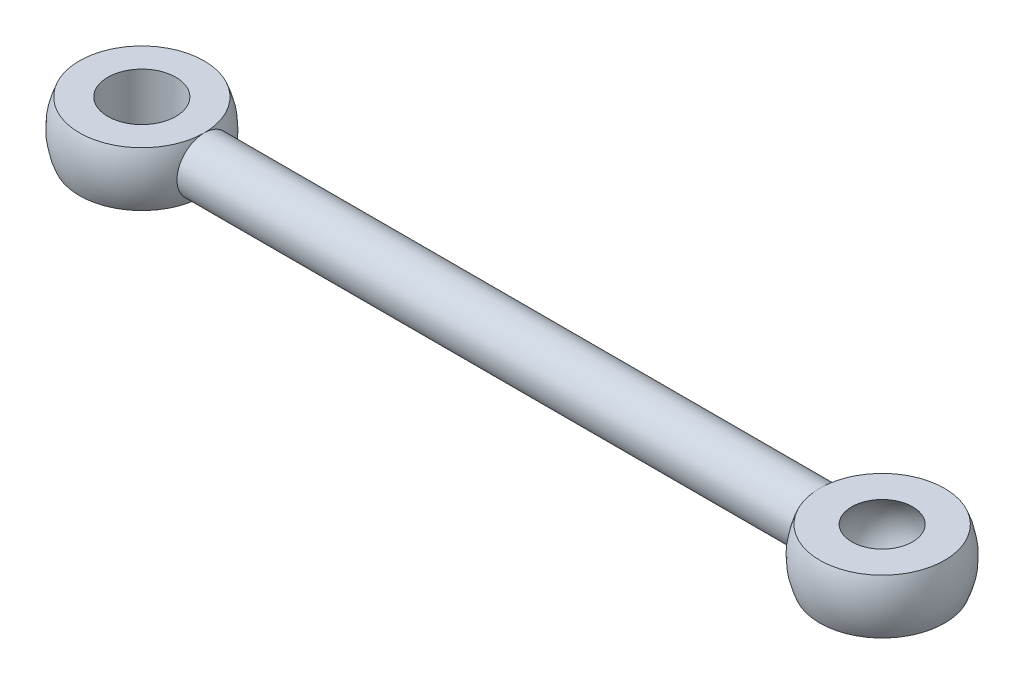
ISO-10303-21;
HEADER;
FILE_DESCRIPTION(('STEP AP214'),'2;1');
FILE_NAME('part.step','',(''),(''),'','','');
FILE_SCHEMA(('AUTOMOTIVE_DESIGN { 1 0 10303 214 1 1 1 1 }'));
ENDSEC;
DATA;
#1=APPLICATION_CONTEXT('core data for automotive mechanical design processes');
#2=APPLICATION_PROTOCOL_DEFINITION('international standard','automotive_design',2000,#1);
#3=PRODUCT_CONTEXT('',#1,'mechanical');
#4=PRODUCT('Part','Part','',(#3));
#5=PRODUCT_RELATED_PRODUCT_CATEGORY('part','',(#4));
#6=PRODUCT_DEFINITION_FORMATION('','',#4);
#7=PRODUCT_DEFINITION_CONTEXT('part definition',#1,'design');
#8=PRODUCT_DEFINITION('design','',#6,#7);
#9=PRODUCT_DEFINITION_SHAPE('','',#8);
#10=(LENGTH_UNIT() NAMED_UNIT(*) SI_UNIT(.MILLI.,.METRE.));
#11=(NAMED_UNIT(*) PLANE_ANGLE_UNIT() SI_UNIT($,.RADIAN.));
#12=(NAMED_UNIT(*) SI_UNIT($,.STERADIAN.) SOLID_ANGLE_UNIT());
#13=UNCERTAINTY_MEASURE_WITH_UNIT(LENGTH_MEASURE(1.E-05),#10,'distance_accuracy_value','');
#14=(GEOMETRIC_REPRESENTATION_CONTEXT(3) GLOBAL_UNCERTAINTY_ASSIGNED_CONTEXT((#13)) GLOBAL_UNIT_ASSIGNED_CONTEXT((#10,
#11,#12)) REPRESENTATION_CONTEXT('',''));
#15=CARTESIAN_POINT('',(0.,0.,0.));
#16=DIRECTION('',(0.,0.,1.));
#17=DIRECTION('',(1.,0.,0.));
#18=AXIS2_PLACEMENT_3D('',#15,#16,#17);
#19=CARTESIAN_POINT('',(-18.7015718787087,0.,0.));
#20=DIRECTION('',(1.,0.,0.));
#21=DIRECTION('',(0.,1.,0.));
#22=AXIS2_PLACEMENT_3D('',#19,#20,#21);
#23=SPHERICAL_SURFACE('',#22,5.);
#24=CARTESIAN_POINT('',(-18.7015718787087,1.99999999999999,0.));
#25=DIRECTION('',(0.,1.,0.));
#26=DIRECTION('',(0.,0.,1.));
#27=AXIS2_PLACEMENT_3D('',#24,#25,#26);
#28=CIRCLE('',#27,4.58257569495584);
#29=CARTESIAN_POINT('',(-14.1189961837528,1.99999999999999,0.));
#30=VERTEX_POINT('',#29);
#31=EDGE_CURVE('E11',#30,#30,#28,.F.);
#32=ORIENTED_EDGE('',*,*,#31,.T.);
#33=CARTESIAN_POINT('',(-14.1189961837528,0.,0.));
#34=DIRECTION('',(1.,0.,0.));
#35=DIRECTION('',(0.,1.,0.));
#36=AXIS2_PLACEMENT_3D('',#33,#34,#35);
#37=CIRCLE('',#36,2.00000000000001);
#38=CARTESIAN_POINT('',(-14.1189961837528,-2.00000000000002,0.));
#39=VERTEX_POINT('',#38);
#40=EDGE_CURVE('E70',#39,#30,#37,.T.);
#41=ORIENTED_EDGE('',*,*,#40,.F.);
#42=CARTESIAN_POINT('',(-18.7015718787087,-2.00000000000002,0.));
#43=DIRECTION('',(0.,-1.,0.));
#44=DIRECTION('',(0.,0.,-1.));
#45=AXIS2_PLACEMENT_3D('',#42,#43,#44);
#46=CIRCLE('',#45,4.58257569495584);
#47=EDGE_CURVE('E48',#39,#39,#46,.F.);
#48=ORIENTED_EDGE('',*,*,#47,.T.);
#49=EDGE_CURVE('E68',#30,#39,#37,.T.);
#50=ORIENTED_EDGE('',*,*,#49,.F.);
#51=EDGE_LOOP('',(#32,#41,#48,#50));
#52=FACE_BOUND('',#51,.T.);
#53=ADVANCED_FACE('F39',(#52),#23,.T.);
#54=CARTESIAN_POINT('',(35.6984281212913,0.,0.));
#55=DIRECTION('',(1.,0.,0.));
#56=DIRECTION('',(0.,-1.,0.));
#57=AXIS2_PLACEMENT_3D('',#54,#55,#56);
#58=SPHERICAL_SURFACE('',#57,5.);
#59=CARTESIAN_POINT('',(31.1158524263355,0.,0.));
#60=DIRECTION('',(1.,0.,0.));
#61=DIRECTION('',(0.,1.,0.));
#62=AXIS2_PLACEMENT_3D('',#59,#60,#61);
#63=CIRCLE('',#62,2.);
#64=CARTESIAN_POINT('',(31.1158524263355,-1.99999999999999,0.));
#65=VERTEX_POINT('',#64);
#66=CARTESIAN_POINT('',(31.1158524263355,1.99999999999999,0.));
#67=VERTEX_POINT('',#66);
#68=EDGE_CURVE('E88',#65,#67,#63,.T.);
#69=ORIENTED_EDGE('',*,*,#68,.T.);
#70=CARTESIAN_POINT('',(35.6984281212913,2.,0.));
#71=DIRECTION('',(0.,1.,0.));
#72=DIRECTION('',(0.,0.,1.));
#73=AXIS2_PLACEMENT_3D('',#70,#71,#72);
#74=CIRCLE('',#73,4.58257569495584);
#75=EDGE_CURVE('E58',#67,#67,#74,.F.);
#76=ORIENTED_EDGE('',*,*,#75,.T.);
#77=EDGE_CURVE('E84',#67,#65,#63,.T.);
#78=ORIENTED_EDGE('',*,*,#77,.T.);
#79=CARTESIAN_POINT('',(35.6984281212913,-1.99999999999999,0.));
#80=DIRECTION('',(0.,-1.,0.));
#81=DIRECTION('',(0.,0.,-1.));
#82=AXIS2_PLACEMENT_3D('',#79,#80,#81);
#83=CIRCLE('',#82,4.58257569495584);
#84=EDGE_CURVE('E53',#65,#65,#83,.F.);
#85=ORIENTED_EDGE('',*,*,#84,.T.);
#86=EDGE_LOOP('',(#69,#76,#78,#85));
#87=FACE_BOUND('',#86,.T.);
#88=ADVANCED_FACE('F41',(#87),#58,.T.);
#89=CARTESIAN_POINT('',(40.6984281212913,0.,0.));
#90=DIRECTION('',(1.,0.,0.));
#91=DIRECTION('',(0.,1.,0.));
#92=AXIS2_PLACEMENT_3D('',#89,#90,#91);
#93=CYLINDRICAL_SURFACE('',#92,2.);
#94=ORIENTED_EDGE('',*,*,#49,.T.);
#95=ORIENTED_EDGE('',*,*,#40,.T.);
#96=EDGE_LOOP('',(#94,#95));
#97=FACE_BOUND('',#96,.T.);
#98=ORIENTED_EDGE('',*,*,#77,.F.);
#99=ORIENTED_EDGE('',*,*,#68,.F.);
#100=EDGE_LOOP('',(#98,#99));
#101=FACE_BOUND('',#100,.T.);
#102=ADVANCED_FACE('F111',(#97,#101),#93,.T.);
#103=CARTESIAN_POINT('',(31.1158524263355,-1.99999999999999,30.));
#104=DIRECTION('',(0.,-1.,0.));
#105=DIRECTION('',(0.,0.,-1.));
#106=AXIS2_PLACEMENT_3D('',#103,#104,#105);
#107=PLANE('',#106);
#108=CARTESIAN_POINT('',(35.6984281212913,-1.99999999999999,0.));
#109=DIRECTION('',(0.,-1.,0.));
#110=DIRECTION('',(0.,0.,-1.));
#111=AXIS2_PLACEMENT_3D('',#108,#109,#110);
#112=CIRCLE('',#111,2.2360679774998);
#113=CARTESIAN_POINT('',(35.6984281212913,-1.99999999999999,-2.2360679774998));
#114=VERTEX_POINT('',#113);
#115=EDGE_CURVE('E79',#114,#114,#112,.F.);
#116=ORIENTED_EDGE('',*,*,#115,.T.);
#117=EDGE_LOOP('',(#116));
#118=FACE_BOUND('',#117,.T.);
#119=ORIENTED_EDGE('',*,*,#84,.F.);
#120=EDGE_LOOP('',(#119));
#121=FACE_BOUND('',#120,.T.);
#122=ADVANCED_FACE('F120',(#118,#121),#107,.T.);
#123=CARTESIAN_POINT('',(31.1158524263355,2.,30.));
#124=DIRECTION('',(0.,1.,0.));
#125=DIRECTION('',(0.,0.,1.));
#126=AXIS2_PLACEMENT_3D('',#123,#124,#125);
#127=PLANE('',#126);
#128=CARTESIAN_POINT('',(35.6984281212913,2.,0.));
#129=DIRECTION('',(0.,1.,0.));
#130=DIRECTION('',(0.,0.,1.));
#131=AXIS2_PLACEMENT_3D('',#128,#129,#130);
#132=CIRCLE('',#131,2.23606797749979);
#133=CARTESIAN_POINT('',(35.6984281212913,2.,2.23606797749979));
#134=VERTEX_POINT('',#133);
#135=EDGE_CURVE('E76',#134,#134,#132,.F.);
#136=ORIENTED_EDGE('',*,*,#135,.T.);
#137=EDGE_LOOP('',(#136));
#138=FACE_BOUND('',#137,.T.);
#139=ORIENTED_EDGE('',*,*,#75,.F.);
#140=EDGE_LOOP('',(#139));
#141=FACE_BOUND('',#140,.T.);
#142=ADVANCED_FACE('F125',(#138,#141),#127,.T.);
#143=CARTESIAN_POINT('',(35.6984281212913,0.,0.));
#144=DIRECTION('',(0.,0.,-1.));
#145=DIRECTION('',(1.,0.,0.));
#146=AXIS2_PLACEMENT_3D('',#143,#144,#145);
#147=SPHERICAL_SURFACE('',#146,3.);
#148=CARTESIAN_POINT('',(35.6984281212913,0.,0.));
#149=DIRECTION('',(0.,-1.,0.));
#150=DIRECTION('',(0.,0.,-1.));
#151=AXIS2_PLACEMENT_3D('',#148,#149,#150);
#152=SPHERICAL_SURFACE('',#151,3.);
#153=ORIENTED_EDGE('',*,*,#115,.F.);
#154=EDGE_LOOP('',(#153));
#155=FACE_BOUND('',#154,.T.);
#156=ORIENTED_EDGE('',*,*,#135,.F.);
#157=EDGE_LOOP('',(#156));
#158=FACE_BOUND('',#157,.T.);
#159=ADVANCED_FACE('F135',(#155,#158),#152,.F.);
#160=CARTESIAN_POINT('',(-14.1189961837528,-2.00000000000002,30.));
#161=DIRECTION('',(0.,-1.,0.));
#162=DIRECTION('',(0.,0.,-1.));
#163=AXIS2_PLACEMENT_3D('',#160,#161,#162);
#164=PLANE('',#163);
#165=CARTESIAN_POINT('',(-18.7015718787087,-2.00000000000002,0.));
#166=DIRECTION('',(0.,-1.,0.));
#167=DIRECTION('',(0.,0.,-1.));
#168=AXIS2_PLACEMENT_3D('',#165,#166,#167);
#169=CIRCLE('',#168,2.5);
#170=CARTESIAN_POINT('',(-18.7015718787087,-2.00000000000002,-2.5));
#171=VERTEX_POINT('',#170);
#172=EDGE_CURVE('E80',#171,#171,#169,.T.);
#173=ORIENTED_EDGE('',*,*,#172,.F.);
#174=EDGE_LOOP('',(#173));
#175=FACE_BOUND('',#174,.T.);
#176=ORIENTED_EDGE('',*,*,#47,.F.);
#177=EDGE_LOOP('',(#176));
#178=FACE_BOUND('',#177,.T.);
#179=ADVANCED_FACE('F107',(#175,#178),#164,.T.);
#180=CARTESIAN_POINT('',(-14.1189961837528,1.99999999999999,30.));
#181=DIRECTION('',(0.,1.,0.));
#182=DIRECTION('',(0.,0.,1.));
#183=AXIS2_PLACEMENT_3D('',#180,#181,#182);
#184=PLANE('',#183);
#185=CARTESIAN_POINT('',(-18.7015718787087,1.99999999999999,0.));
#186=DIRECTION('',(0.,1.,0.));
#187=DIRECTION('',(0.,0.,1.));
#188=AXIS2_PLACEMENT_3D('',#185,#186,#187);
#189=CIRCLE('',#188,2.5);
#190=CARTESIAN_POINT('',(-18.7015718787087,1.99999999999999,2.5));
#191=VERTEX_POINT('',#190);
#192=EDGE_CURVE('E97',#191,#191,#189,.T.);
#193=ORIENTED_EDGE('',*,*,#192,.F.);
#194=EDGE_LOOP('',(#193));
#195=FACE_BOUND('',#194,.T.);
#196=ORIENTED_EDGE('',*,*,#31,.F.);
#197=EDGE_LOOP('',(#196));
#198=FACE_BOUND('',#197,.T.);
#199=ADVANCED_FACE('F104',(#195,#198),#184,.T.);
#200=CARTESIAN_POINT('',(-18.7015718787087,-28.,0.));
#201=DIRECTION('',(0.,1.,0.));
#202=DIRECTION('',(0.,0.,1.));
#203=AXIS2_PLACEMENT_3D('',#200,#201,#202);
#204=CYLINDRICAL_SURFACE('',#203,2.5);
#205=ORIENTED_EDGE('',*,*,#172,.T.);
#206=EDGE_LOOP('',(#205));
#207=FACE_BOUND('',#206,.T.);
#208=ORIENTED_EDGE('',*,*,#192,.T.);
#209=EDGE_LOOP('',(#208));
#210=FACE_BOUND('',#209,.T.);
#211=ADVANCED_FACE('F102',(#207,#210),#204,.F.);
#212=CLOSED_SHELL('',(#53,#88,#102,#122,#142,#159,#179,#199,#211));
#213=MANIFOLD_SOLID_BREP('B2',#212);
#214=ADVANCED_BREP_SHAPE_REPRESENTATION('',(#18,#213),#14);
#215=SHAPE_DEFINITION_REPRESENTATION(#9,#214);
ENDSEC;
END-ISO-10303-21;
